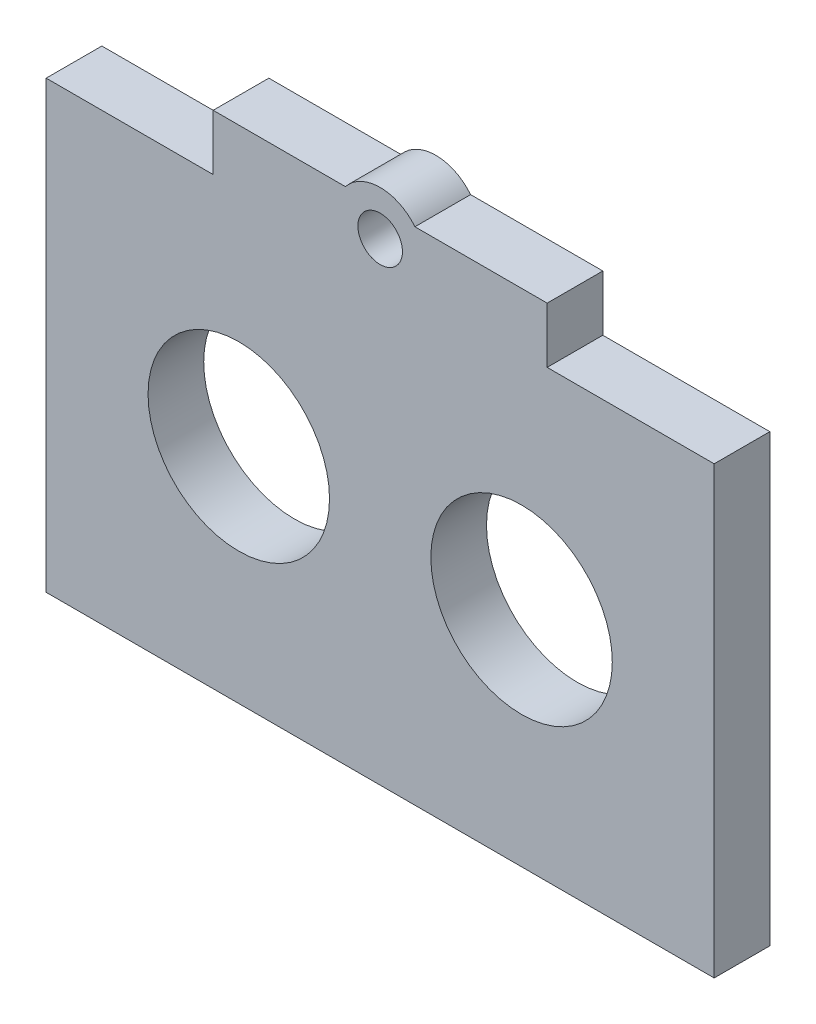
ISO-10303-21;
HEADER;
FILE_DESCRIPTION(('STEP AP214'),'2;1');
FILE_NAME('part.step','',(''),(''),'','','');
FILE_SCHEMA(('AUTOMOTIVE_DESIGN { 1 0 10303 214 1 1 1 1 }'));
ENDSEC;
DATA;
#1=APPLICATION_CONTEXT('core data for automotive mechanical design processes');
#2=APPLICATION_PROTOCOL_DEFINITION('international standard','automotive_design',2000,#1);
#3=PRODUCT_CONTEXT('',#1,'mechanical');
#4=PRODUCT('Part','Part','',(#3));
#5=PRODUCT_RELATED_PRODUCT_CATEGORY('part','',(#4));
#6=PRODUCT_DEFINITION_FORMATION('','',#4);
#7=PRODUCT_DEFINITION_CONTEXT('part definition',#1,'design');
#8=PRODUCT_DEFINITION('design','',#6,#7);
#9=PRODUCT_DEFINITION_SHAPE('','',#8);
#10=(LENGTH_UNIT() NAMED_UNIT(*) SI_UNIT(.MILLI.,.METRE.));
#11=(NAMED_UNIT(*) PLANE_ANGLE_UNIT() SI_UNIT($,.RADIAN.));
#12=(NAMED_UNIT(*) SI_UNIT($,.STERADIAN.) SOLID_ANGLE_UNIT());
#13=UNCERTAINTY_MEASURE_WITH_UNIT(LENGTH_MEASURE(1.E-05),#10,'distance_accuracy_value','');
#14=(GEOMETRIC_REPRESENTATION_CONTEXT(3) GLOBAL_UNCERTAINTY_ASSIGNED_CONTEXT((#13)) GLOBAL_UNIT_ASSIGNED_CONTEXT((#10,
#11,#12)) REPRESENTATION_CONTEXT('',''));
#15=CARTESIAN_POINT('',(0.,0.,0.));
#16=DIRECTION('',(0.,0.,1.));
#17=DIRECTION('',(1.,0.,0.));
#18=AXIS2_PLACEMENT_3D('',#15,#16,#17);
#19=CARTESIAN_POINT('',(0.,25.,5.));
#20=DIRECTION('',(0.,-1.,0.));
#21=DIRECTION('',(1.,0.,0.));
#22=AXIS2_PLACEMENT_3D('',#19,#20,#21);
#23=PLANE('',#22);
#24=DIRECTION('',(-1.,0.,0.));
#25=VECTOR('',#24,1.);
#26=CARTESIAN_POINT('',(0.,25.,0.));
#27=LINE('',#26,#25);
#28=CARTESIAN_POINT('',(15.,25.,0.));
#29=VERTEX_POINT('',#28);
#30=CARTESIAN_POINT('',(3.1224989991992,25.,0.));
#31=VERTEX_POINT('',#30);
#32=EDGE_CURVE('E203',#29,#31,#27,.T.);
#33=ORIENTED_EDGE('',*,*,#32,.T.);
#34=DIRECTION('',(0.,0.,-1.));
#35=VECTOR('',#34,1.);
#36=CARTESIAN_POINT('',(3.1224989991992,25.,5.));
#37=LINE('',#36,#35);
#38=CARTESIAN_POINT('',(3.1224989991992,25.,5.));
#39=VERTEX_POINT('',#38);
#40=EDGE_CURVE('E11',#39,#31,#37,.T.);
#41=ORIENTED_EDGE('',*,*,#40,.F.);
#42=DIRECTION('',(-1.,0.,0.));
#43=VECTOR('',#42,1.);
#44=CARTESIAN_POINT('',(0.,25.,5.));
#45=LINE('',#44,#43);
#46=CARTESIAN_POINT('',(15.,25.,5.));
#47=VERTEX_POINT('',#46);
#48=EDGE_CURVE('E157',#47,#39,#45,.T.);
#49=ORIENTED_EDGE('',*,*,#48,.F.);
#50=DIRECTION('',(0.,0.,-1.));
#51=VECTOR('',#50,1.);
#52=CARTESIAN_POINT('',(15.,25.,5.));
#53=LINE('',#52,#51);
#54=EDGE_CURVE('E171',#47,#29,#53,.T.);
#55=ORIENTED_EDGE('',*,*,#54,.T.);
#56=EDGE_LOOP('',(#33,#41,#49,#55));
#57=FACE_BOUND('',#56,.T.);
#58=ADVANCED_FACE('F34',(#57),#23,.F.);
#59=CARTESIAN_POINT('',(0.,22.5,5.));
#60=DIRECTION('',(0.,0.,-1.));
#61=DIRECTION('',(-1.,0.,0.));
#62=AXIS2_PLACEMENT_3D('',#59,#60,#61);
#63=CYLINDRICAL_SURFACE('',#62,4.);
#64=CARTESIAN_POINT('',(0.,22.5,0.));
#65=DIRECTION('',(0.,0.,1.));
#66=DIRECTION('',(1.,0.,0.));
#67=AXIS2_PLACEMENT_3D('',#64,#65,#66);
#68=CIRCLE('',#67,4.);
#69=CARTESIAN_POINT('',(-3.1224989991992,25.,0.));
#70=VERTEX_POINT('',#69);
#71=EDGE_CURVE('E196',#31,#70,#68,.T.);
#72=ORIENTED_EDGE('',*,*,#71,.T.);
#73=DIRECTION('',(0.,0.,-1.));
#74=VECTOR('',#73,1.);
#75=CARTESIAN_POINT('',(-3.1224989991992,25.,5.));
#76=LINE('',#75,#74);
#77=CARTESIAN_POINT('',(-3.1224989991992,25.,5.));
#78=VERTEX_POINT('',#77);
#79=EDGE_CURVE('E42',#78,#70,#76,.T.);
#80=ORIENTED_EDGE('',*,*,#79,.F.);
#81=CARTESIAN_POINT('',(0.,22.5,5.));
#82=DIRECTION('',(0.,0.,1.));
#83=DIRECTION('',(1.,0.,0.));
#84=AXIS2_PLACEMENT_3D('',#81,#82,#83);
#85=CIRCLE('',#84,4.);
#86=EDGE_CURVE('E95',#39,#78,#85,.T.);
#87=ORIENTED_EDGE('',*,*,#86,.F.);
#88=ORIENTED_EDGE('',*,*,#40,.T.);
#89=EDGE_LOOP('',(#72,#80,#87,#88));
#90=FACE_BOUND('',#89,.T.);
#91=ADVANCED_FACE('F235',(#90),#63,.T.);
#92=CARTESIAN_POINT('',(0.,25.,5.));
#93=DIRECTION('',(0.,-1.,0.));
#94=DIRECTION('',(1.,0.,0.));
#95=AXIS2_PLACEMENT_3D('',#92,#93,#94);
#96=PLANE('',#95);
#97=DIRECTION('',(-1.,0.,0.));
#98=VECTOR('',#97,1.);
#99=CARTESIAN_POINT('',(0.,25.,0.));
#100=LINE('',#99,#98);
#101=CARTESIAN_POINT('',(-15.,25.,0.));
#102=VERTEX_POINT('',#101);
#103=EDGE_CURVE('E190',#70,#102,#100,.T.);
#104=ORIENTED_EDGE('',*,*,#103,.T.);
#105=DIRECTION('',(0.,0.,-1.));
#106=VECTOR('',#105,1.);
#107=CARTESIAN_POINT('',(-15.,25.,5.));
#108=LINE('',#107,#106);
#109=CARTESIAN_POINT('',(-15.,25.,5.));
#110=VERTEX_POINT('',#109);
#111=EDGE_CURVE('E182',#110,#102,#108,.T.);
#112=ORIENTED_EDGE('',*,*,#111,.F.);
#113=DIRECTION('',(-1.,0.,0.));
#114=VECTOR('',#113,1.);
#115=CARTESIAN_POINT('',(0.,25.,5.));
#116=LINE('',#115,#114);
#117=EDGE_CURVE('E151',#78,#110,#116,.T.);
#118=ORIENTED_EDGE('',*,*,#117,.F.);
#119=ORIENTED_EDGE('',*,*,#79,.T.);
#120=EDGE_LOOP('',(#104,#112,#118,#119));
#121=FACE_BOUND('',#120,.T.);
#122=ADVANCED_FACE('F188',(#121),#96,.F.);
#123=CARTESIAN_POINT('',(-15.,0.,5.));
#124=DIRECTION('',(-1.,0.,0.));
#125=DIRECTION('',(0.,0.,1.));
#126=AXIS2_PLACEMENT_3D('',#123,#124,#125);
#127=PLANE('',#126);
#128=DIRECTION('',(0.,1.,0.));
#129=VECTOR('',#128,1.);
#130=CARTESIAN_POINT('',(-15.,0.,0.));
#131=LINE('',#130,#129);
#132=CARTESIAN_POINT('',(-15.,20.,0.));
#133=VERTEX_POINT('',#132);
#134=EDGE_CURVE('E199',#133,#102,#131,.T.);
#135=ORIENTED_EDGE('',*,*,#134,.F.);
#136=DIRECTION('',(0.,0.,-1.));
#137=VECTOR('',#136,1.);
#138=CARTESIAN_POINT('',(-15.,20.,5.));
#139=LINE('',#138,#137);
#140=CARTESIAN_POINT('',(-15.,20.,5.));
#141=VERTEX_POINT('',#140);
#142=EDGE_CURVE('E180',#141,#133,#139,.T.);
#143=ORIENTED_EDGE('',*,*,#142,.F.);
#144=DIRECTION('',(0.,1.,0.));
#145=VECTOR('',#144,1.);
#146=CARTESIAN_POINT('',(-15.,0.,5.));
#147=LINE('',#146,#145);
#148=EDGE_CURVE('E146',#141,#110,#147,.T.);
#149=ORIENTED_EDGE('',*,*,#148,.T.);
#150=ORIENTED_EDGE('',*,*,#111,.T.);
#151=EDGE_LOOP('',(#135,#143,#149,#150));
#152=FACE_BOUND('',#151,.T.);
#153=ADVANCED_FACE('F338',(#152),#127,.T.);
#154=CARTESIAN_POINT('',(0.,20.,5.));
#155=DIRECTION('',(0.,1.,0.));
#156=DIRECTION('',(-1.,0.,0.));
#157=AXIS2_PLACEMENT_3D('',#154,#155,#156);
#158=PLANE('',#157);
#159=DIRECTION('',(1.,0.,0.));
#160=VECTOR('',#159,1.);
#161=CARTESIAN_POINT('',(0.,20.,0.));
#162=LINE('',#161,#160);
#163=CARTESIAN_POINT('',(-30.,20.,0.));
#164=VERTEX_POINT('',#163);
#165=EDGE_CURVE('E201',#164,#133,#162,.T.);
#166=ORIENTED_EDGE('',*,*,#165,.F.);
#167=DIRECTION('',(0.,0.,-1.));
#168=VECTOR('',#167,1.);
#169=CARTESIAN_POINT('',(-30.,20.,5.));
#170=LINE('',#169,#168);
#171=CARTESIAN_POINT('',(-30.,20.,5.));
#172=VERTEX_POINT('',#171);
#173=EDGE_CURVE('E178',#172,#164,#170,.T.);
#174=ORIENTED_EDGE('',*,*,#173,.F.);
#175=DIRECTION('',(1.,0.,0.));
#176=VECTOR('',#175,1.);
#177=CARTESIAN_POINT('',(0.,20.,5.));
#178=LINE('',#177,#176);
#179=EDGE_CURVE('E139',#172,#141,#178,.T.);
#180=ORIENTED_EDGE('',*,*,#179,.T.);
#181=ORIENTED_EDGE('',*,*,#142,.T.);
#182=EDGE_LOOP('',(#166,#174,#180,#181));
#183=FACE_BOUND('',#182,.T.);
#184=ADVANCED_FACE('F302',(#183),#158,.T.);
#185=CARTESIAN_POINT('',(-30.,0.,5.));
#186=DIRECTION('',(-1.,0.,0.));
#187=DIRECTION('',(0.,-1.,0.));
#188=AXIS2_PLACEMENT_3D('',#185,#186,#187);
#189=PLANE('',#188);
#190=DIRECTION('',(0.,1.,0.));
#191=VECTOR('',#190,1.);
#192=CARTESIAN_POINT('',(-30.,0.,0.));
#193=LINE('',#192,#191);
#194=CARTESIAN_POINT('',(-30.,-20.,0.));
#195=VERTEX_POINT('',#194);
#196=EDGE_CURVE('E208',#195,#164,#193,.T.);
#197=ORIENTED_EDGE('',*,*,#196,.F.);
#198=DIRECTION('',(0.,0.,-1.));
#199=VECTOR('',#198,1.);
#200=CARTESIAN_POINT('',(-30.,-20.,5.));
#201=LINE('',#200,#199);
#202=CARTESIAN_POINT('',(-30.,-20.,5.));
#203=VERTEX_POINT('',#202);
#204=EDGE_CURVE('E176',#203,#195,#201,.T.);
#205=ORIENTED_EDGE('',*,*,#204,.F.);
#206=DIRECTION('',(0.,1.,0.));
#207=VECTOR('',#206,1.);
#208=CARTESIAN_POINT('',(-30.,0.,5.));
#209=LINE('',#208,#207);
#210=EDGE_CURVE('E145',#203,#172,#209,.T.);
#211=ORIENTED_EDGE('',*,*,#210,.T.);
#212=ORIENTED_EDGE('',*,*,#173,.T.);
#213=EDGE_LOOP('',(#197,#205,#211,#212));
#214=FACE_BOUND('',#213,.T.);
#215=ADVANCED_FACE('F319',(#214),#189,.T.);
#216=CARTESIAN_POINT('',(0.,-20.,5.));
#217=DIRECTION('',(0.,1.,0.));
#218=DIRECTION('',(-1.,0.,0.));
#219=AXIS2_PLACEMENT_3D('',#216,#217,#218);
#220=PLANE('',#219);
#221=DIRECTION('',(1.,0.,0.));
#222=VECTOR('',#221,1.);
#223=CARTESIAN_POINT('',(0.,-20.,0.));
#224=LINE('',#223,#222);
#225=CARTESIAN_POINT('',(30.,-20.,0.));
#226=VERTEX_POINT('',#225);
#227=EDGE_CURVE('E212',#195,#226,#224,.T.);
#228=ORIENTED_EDGE('',*,*,#227,.T.);
#229=DIRECTION('',(0.,0.,-1.));
#230=VECTOR('',#229,1.);
#231=CARTESIAN_POINT('',(30.,-20.,5.));
#232=LINE('',#231,#230);
#233=CARTESIAN_POINT('',(30.,-20.,5.));
#234=VERTEX_POINT('',#233);
#235=EDGE_CURVE('E135',#234,#226,#232,.T.);
#236=ORIENTED_EDGE('',*,*,#235,.F.);
#237=DIRECTION('',(1.,0.,0.));
#238=VECTOR('',#237,1.);
#239=CARTESIAN_POINT('',(0.,-20.,5.));
#240=LINE('',#239,#238);
#241=EDGE_CURVE('E122',#203,#234,#240,.T.);
#242=ORIENTED_EDGE('',*,*,#241,.F.);
#243=ORIENTED_EDGE('',*,*,#204,.T.);
#244=EDGE_LOOP('',(#228,#236,#242,#243));
#245=FACE_BOUND('',#244,.T.);
#246=ADVANCED_FACE('F310',(#245),#220,.F.);
#247=CARTESIAN_POINT('',(30.,0.,5.));
#248=DIRECTION('',(-1.,0.,0.));
#249=DIRECTION('',(0.,-1.,0.));
#250=AXIS2_PLACEMENT_3D('',#247,#248,#249);
#251=PLANE('',#250);
#252=DIRECTION('',(0.,1.,0.));
#253=VECTOR('',#252,1.);
#254=CARTESIAN_POINT('',(30.,0.,0.));
#255=LINE('',#254,#253);
#256=CARTESIAN_POINT('',(30.,20.,0.));
#257=VERTEX_POINT('',#256);
#258=EDGE_CURVE('E131',#226,#257,#255,.T.);
#259=ORIENTED_EDGE('',*,*,#258,.T.);
#260=DIRECTION('',(0.,0.,-1.));
#261=VECTOR('',#260,1.);
#262=CARTESIAN_POINT('',(30.,20.,5.));
#263=LINE('',#262,#261);
#264=CARTESIAN_POINT('',(30.,20.,5.));
#265=VERTEX_POINT('',#264);
#266=EDGE_CURVE('E128',#265,#257,#263,.T.);
#267=ORIENTED_EDGE('',*,*,#266,.F.);
#268=DIRECTION('',(0.,1.,0.));
#269=VECTOR('',#268,1.);
#270=CARTESIAN_POINT('',(30.,0.,5.));
#271=LINE('',#270,#269);
#272=EDGE_CURVE('E114',#234,#265,#271,.T.);
#273=ORIENTED_EDGE('',*,*,#272,.F.);
#274=ORIENTED_EDGE('',*,*,#235,.T.);
#275=EDGE_LOOP('',(#259,#267,#273,#274));
#276=FACE_BOUND('',#275,.T.);
#277=ADVANCED_FACE('F129',(#276),#251,.F.);
#278=CARTESIAN_POINT('',(15.,20.,0.));
#279=VERTEX_POINT('',#278);
#280=EDGE_CURVE('E209',#279,#257,#162,.T.);
#281=ORIENTED_EDGE('',*,*,#280,.F.);
#282=DIRECTION('',(0.,0.,-1.));
#283=VECTOR('',#282,1.);
#284=CARTESIAN_POINT('',(15.,20.,5.));
#285=LINE('',#284,#283);
#286=CARTESIAN_POINT('',(15.,20.,5.));
#287=VERTEX_POINT('',#286);
#288=EDGE_CURVE('E84',#287,#279,#285,.T.);
#289=ORIENTED_EDGE('',*,*,#288,.F.);
#290=EDGE_CURVE('E119',#287,#265,#178,.T.);
#291=ORIENTED_EDGE('',*,*,#290,.T.);
#292=ORIENTED_EDGE('',*,*,#266,.T.);
#293=EDGE_LOOP('',(#281,#289,#291,#292));
#294=FACE_BOUND('',#293,.T.);
#295=ADVANCED_FACE('F137',(#294),#158,.T.);
#296=CARTESIAN_POINT('',(-12.7,0.,5.));
#297=DIRECTION('',(0.,0.,-1.));
#298=DIRECTION('',(-1.,0.,0.));
#299=AXIS2_PLACEMENT_3D('',#296,#297,#298);
#300=CYLINDRICAL_SURFACE('',#299,8.15);
#301=CARTESIAN_POINT('',(-12.7,0.,5.));
#302=DIRECTION('',(0.,0.,1.));
#303=DIRECTION('',(1.,0.,0.));
#304=AXIS2_PLACEMENT_3D('',#301,#302,#303);
#305=CIRCLE('',#304,8.15);
#306=CARTESIAN_POINT('',(-4.55,0.,5.));
#307=VERTEX_POINT('',#306);
#308=EDGE_CURVE('E244',#307,#307,#305,.T.);
#309=ORIENTED_EDGE('',*,*,#308,.T.);
#310=EDGE_LOOP('',(#309));
#311=FACE_BOUND('',#310,.T.);
#312=CARTESIAN_POINT('',(-12.7,0.,0.));
#313=DIRECTION('',(0.,0.,1.));
#314=DIRECTION('',(1.,0.,0.));
#315=AXIS2_PLACEMENT_3D('',#312,#313,#314);
#316=CIRCLE('',#315,8.15);
#317=CARTESIAN_POINT('',(-4.55,0.,0.));
#318=VERTEX_POINT('',#317);
#319=EDGE_CURVE('E162',#318,#318,#316,.T.);
#320=ORIENTED_EDGE('',*,*,#319,.F.);
#321=EDGE_LOOP('',(#320));
#322=FACE_BOUND('',#321,.T.);
#323=ADVANCED_FACE('F222',(#311,#322),#300,.F.);
#324=CARTESIAN_POINT('',(12.7,0.,5.));
#325=DIRECTION('',(0.,0.,-1.));
#326=DIRECTION('',(-1.,0.,0.));
#327=AXIS2_PLACEMENT_3D('',#324,#325,#326);
#328=CYLINDRICAL_SURFACE('',#327,8.15);
#329=CARTESIAN_POINT('',(12.7,0.,5.));
#330=DIRECTION('',(0.,0.,1.));
#331=DIRECTION('',(1.,0.,0.));
#332=AXIS2_PLACEMENT_3D('',#329,#330,#331);
#333=CIRCLE('',#332,8.15);
#334=CARTESIAN_POINT('',(20.85,0.,5.));
#335=VERTEX_POINT('',#334);
#336=EDGE_CURVE('E140',#335,#335,#333,.T.);
#337=ORIENTED_EDGE('',*,*,#336,.T.);
#338=EDGE_LOOP('',(#337));
#339=FACE_BOUND('',#338,.T.);
#340=CARTESIAN_POINT('',(12.7,0.,0.));
#341=DIRECTION('',(0.,0.,1.));
#342=DIRECTION('',(1.,0.,0.));
#343=AXIS2_PLACEMENT_3D('',#340,#341,#342);
#344=CIRCLE('',#343,8.15);
#345=CARTESIAN_POINT('',(20.85,0.,0.));
#346=VERTEX_POINT('',#345);
#347=EDGE_CURVE('E167',#346,#346,#344,.T.);
#348=ORIENTED_EDGE('',*,*,#347,.F.);
#349=EDGE_LOOP('',(#348));
#350=FACE_BOUND('',#349,.T.);
#351=ADVANCED_FACE('F219',(#339,#350),#328,.F.);
#352=CARTESIAN_POINT('',(15.,0.,5.));
#353=DIRECTION('',(-1.,0.,0.));
#354=DIRECTION('',(0.,0.,1.));
#355=AXIS2_PLACEMENT_3D('',#352,#353,#354);
#356=PLANE('',#355);
#357=DIRECTION('',(0.,1.,0.));
#358=VECTOR('',#357,1.);
#359=CARTESIAN_POINT('',(15.,0.,0.));
#360=LINE('',#359,#358);
#361=EDGE_CURVE('E87',#279,#29,#360,.T.);
#362=ORIENTED_EDGE('',*,*,#361,.T.);
#363=ORIENTED_EDGE('',*,*,#54,.F.);
#364=DIRECTION('',(0.,1.,0.));
#365=VECTOR('',#364,1.);
#366=CARTESIAN_POINT('',(15.,0.,5.));
#367=LINE('',#366,#365);
#368=EDGE_CURVE('E50',#287,#47,#367,.T.);
#369=ORIENTED_EDGE('',*,*,#368,.F.);
#370=ORIENTED_EDGE('',*,*,#288,.T.);
#371=EDGE_LOOP('',(#362,#363,#369,#370));
#372=FACE_BOUND('',#371,.T.);
#373=ADVANCED_FACE('F221',(#372),#356,.F.);
#374=CARTESIAN_POINT('',(0.,22.5,5.));
#375=DIRECTION('',(0.,0.,-1.));
#376=DIRECTION('',(-1.,0.,0.));
#377=AXIS2_PLACEMENT_3D('',#374,#375,#376);
#378=CYLINDRICAL_SURFACE('',#377,2.);
#379=CARTESIAN_POINT('',(0.,22.5,5.));
#380=DIRECTION('',(0.,0.,1.));
#381=DIRECTION('',(1.,0.,0.));
#382=AXIS2_PLACEMENT_3D('',#379,#380,#381);
#383=CIRCLE('',#382,2.);
#384=CARTESIAN_POINT('',(2.,22.5,5.));
#385=VERTEX_POINT('',#384);
#386=EDGE_CURVE('E173',#385,#385,#383,.T.);
#387=ORIENTED_EDGE('',*,*,#386,.T.);
#388=EDGE_LOOP('',(#387));
#389=FACE_BOUND('',#388,.T.);
#390=CARTESIAN_POINT('',(0.,22.5,0.));
#391=DIRECTION('',(0.,0.,1.));
#392=DIRECTION('',(1.,0.,0.));
#393=AXIS2_PLACEMENT_3D('',#390,#391,#392);
#394=CIRCLE('',#393,2.);
#395=CARTESIAN_POINT('',(2.,22.5,0.));
#396=VERTEX_POINT('',#395);
#397=EDGE_CURVE('E158',#396,#396,#394,.T.);
#398=ORIENTED_EDGE('',*,*,#397,.F.);
#399=EDGE_LOOP('',(#398));
#400=FACE_BOUND('',#399,.T.);
#401=ADVANCED_FACE('F229',(#389,#400),#378,.F.);
#402=CARTESIAN_POINT('',(0.,0.,5.));
#403=DIRECTION('',(0.,0.,1.));
#404=DIRECTION('',(1.,0.,0.));
#405=AXIS2_PLACEMENT_3D('',#402,#403,#404);
#406=PLANE('',#405);
#407=ORIENTED_EDGE('',*,*,#48,.T.);
#408=ORIENTED_EDGE('',*,*,#86,.T.);
#409=ORIENTED_EDGE('',*,*,#117,.T.);
#410=ORIENTED_EDGE('',*,*,#148,.F.);
#411=ORIENTED_EDGE('',*,*,#179,.F.);
#412=ORIENTED_EDGE('',*,*,#210,.F.);
#413=ORIENTED_EDGE('',*,*,#241,.T.);
#414=ORIENTED_EDGE('',*,*,#272,.T.);
#415=ORIENTED_EDGE('',*,*,#290,.F.);
#416=ORIENTED_EDGE('',*,*,#368,.T.);
#417=EDGE_LOOP('',(#407,#408,#409,#410,#411,#412,#413,#414,#415,#416));
#418=FACE_BOUND('',#417,.T.);
#419=ORIENTED_EDGE('',*,*,#336,.F.);
#420=EDGE_LOOP('',(#419));
#421=FACE_BOUND('',#420,.T.);
#422=ORIENTED_EDGE('',*,*,#308,.F.);
#423=EDGE_LOOP('',(#422));
#424=FACE_BOUND('',#423,.T.);
#425=ORIENTED_EDGE('',*,*,#386,.F.);
#426=EDGE_LOOP('',(#425));
#427=FACE_BOUND('',#426,.T.);
#428=ADVANCED_FACE('F116',(#418,#421,#424,#427),#406,.T.);
#429=CARTESIAN_POINT('',(0.,0.,0.));
#430=DIRECTION('',(0.,0.,1.));
#431=DIRECTION('',(1.,0.,0.));
#432=AXIS2_PLACEMENT_3D('',#429,#430,#431);
#433=PLANE('',#432);
#434=ORIENTED_EDGE('',*,*,#32,.F.);
#435=ORIENTED_EDGE('',*,*,#361,.F.);
#436=ORIENTED_EDGE('',*,*,#280,.T.);
#437=ORIENTED_EDGE('',*,*,#258,.F.);
#438=ORIENTED_EDGE('',*,*,#227,.F.);
#439=ORIENTED_EDGE('',*,*,#196,.T.);
#440=ORIENTED_EDGE('',*,*,#165,.T.);
#441=ORIENTED_EDGE('',*,*,#134,.T.);
#442=ORIENTED_EDGE('',*,*,#103,.F.);
#443=ORIENTED_EDGE('',*,*,#71,.F.);
#444=EDGE_LOOP('',(#434,#435,#436,#437,#438,#439,#440,#441,#442,#443));
#445=FACE_BOUND('',#444,.T.);
#446=ORIENTED_EDGE('',*,*,#347,.T.);
#447=EDGE_LOOP('',(#446));
#448=FACE_BOUND('',#447,.T.);
#449=ORIENTED_EDGE('',*,*,#319,.T.);
#450=EDGE_LOOP('',(#449));
#451=FACE_BOUND('',#450,.T.);
#452=ORIENTED_EDGE('',*,*,#397,.T.);
#453=EDGE_LOOP('',(#452));
#454=FACE_BOUND('',#453,.T.);
#455=ADVANCED_FACE('F194',(#445,#448,#451,#454),#433,.F.);
#456=CLOSED_SHELL('',(#58,#91,#122,#153,#184,#215,#246,#277,#295,#323,#351,#373,#401,#428,#455));
#457=MANIFOLD_SOLID_BREP('B2',#456);
#458=ADVANCED_BREP_SHAPE_REPRESENTATION('',(#18,#457),#14);
#459=SHAPE_DEFINITION_REPRESENTATION(#9,#458);
ENDSEC;
END-ISO-10303-21;
